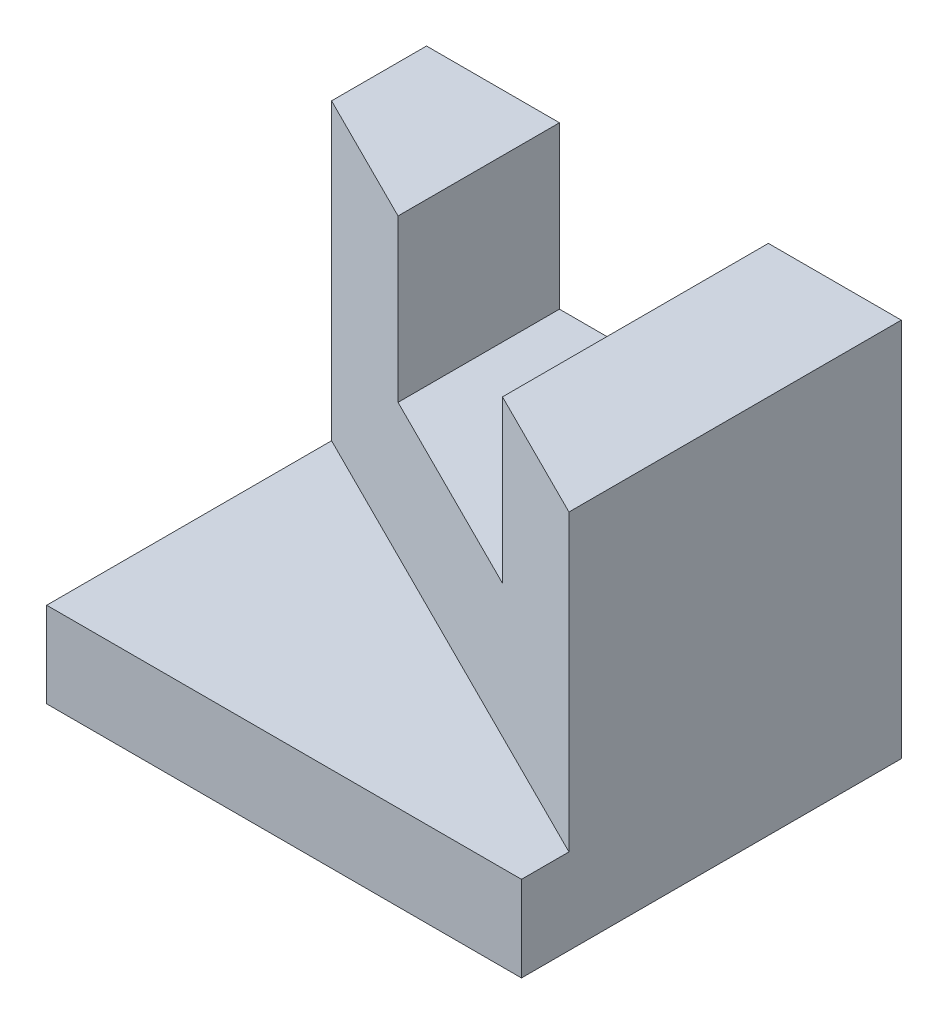
ISO-10303-21;
HEADER;
FILE_DESCRIPTION(('STEP AP214'),'2;1');
FILE_NAME('part.step','',(''),(''),'','','');
FILE_SCHEMA(('AUTOMOTIVE_DESIGN { 1 0 10303 214 1 1 1 1 }'));
ENDSEC;
DATA;
#1=APPLICATION_CONTEXT('core data for automotive mechanical design processes');
#2=APPLICATION_PROTOCOL_DEFINITION('international standard','automotive_design',2000,#1);
#3=PRODUCT_CONTEXT('',#1,'mechanical');
#4=PRODUCT('Part','Part','',(#3));
#5=PRODUCT_RELATED_PRODUCT_CATEGORY('part','',(#4));
#6=PRODUCT_DEFINITION_FORMATION('','',#4);
#7=PRODUCT_DEFINITION_CONTEXT('part definition',#1,'design');
#8=PRODUCT_DEFINITION('design','',#6,#7);
#9=PRODUCT_DEFINITION_SHAPE('','',#8);
#10=(LENGTH_UNIT() NAMED_UNIT(*) SI_UNIT(.MILLI.,.METRE.));
#11=(NAMED_UNIT(*) PLANE_ANGLE_UNIT() SI_UNIT($,.RADIAN.));
#12=(NAMED_UNIT(*) SI_UNIT($,.STERADIAN.) SOLID_ANGLE_UNIT());
#13=UNCERTAINTY_MEASURE_WITH_UNIT(LENGTH_MEASURE(1.E-05),#10,'distance_accuracy_value','');
#14=(GEOMETRIC_REPRESENTATION_CONTEXT(3) GLOBAL_UNCERTAINTY_ASSIGNED_CONTEXT((#13)) GLOBAL_UNIT_ASSIGNED_CONTEXT((#10,
#11,#12)) REPRESENTATION_CONTEXT('',''));
#15=CARTESIAN_POINT('',(0.,0.,0.));
#16=DIRECTION('',(0.,0.,1.));
#17=DIRECTION('',(1.,0.,0.));
#18=AXIS2_PLACEMENT_3D('',#15,#16,#17);
#19=CARTESIAN_POINT('',(0.,80.,0.));
#20=DIRECTION('',(0.,-1.,0.));
#21=DIRECTION('',(0.,0.,-1.));
#22=AXIS2_PLACEMENT_3D('',#19,#20,#21);
#23=PLANE('',#22);
#24=DIRECTION('',(-0.894427190999916,0.,-0.447213595499958));
#25=VECTOR('',#24,1.);
#26=CARTESIAN_POINT('',(100.,80.,70.));
#27=LINE('',#26,#25);
#28=CARTESIAN_POINT('',(28.,80.,34.));
#29=VERTEX_POINT('',#28);
#30=CARTESIAN_POINT('',(0.,80.,20.));
#31=VERTEX_POINT('',#30);
#32=EDGE_CURVE('E239',#29,#31,#27,.T.);
#33=ORIENTED_EDGE('',*,*,#32,.F.);
#34=DIRECTION('',(0.,0.,-1.));
#35=VECTOR('',#34,1.);
#36=CARTESIAN_POINT('',(28.,80.,0.));
#37=LINE('',#36,#35);
#38=CARTESIAN_POINT('',(28.,80.,0.));
#39=VERTEX_POINT('',#38);
#40=EDGE_CURVE('E163',#29,#39,#37,.T.);
#41=ORIENTED_EDGE('',*,*,#40,.T.);
#42=DIRECTION('',(1.,0.,0.));
#43=VECTOR('',#42,1.);
#44=CARTESIAN_POINT('',(0.,80.,0.));
#45=LINE('',#44,#43);
#46=CARTESIAN_POINT('',(0.,80.,0.));
#47=VERTEX_POINT('',#46);
#48=EDGE_CURVE('E271',#47,#39,#45,.T.);
#49=ORIENTED_EDGE('',*,*,#48,.F.);
#50=DIRECTION('',(0.,0.,-1.));
#51=VECTOR('',#50,1.);
#52=CARTESIAN_POINT('',(0.,80.,20.));
#53=LINE('',#52,#51);
#54=EDGE_CURVE('E294',#31,#47,#53,.T.);
#55=ORIENTED_EDGE('',*,*,#54,.F.);
#56=EDGE_LOOP('',(#33,#41,#49,#55));
#57=FACE_BOUND('',#56,.T.);
#58=ADVANCED_FACE('F69',(#57),#23,.F.);
#59=CARTESIAN_POINT('',(0.,18.,0.));
#60=DIRECTION('',(0.,-1.,0.));
#61=DIRECTION('',(0.,0.,-1.));
#62=AXIS2_PLACEMENT_3D('',#59,#60,#61);
#63=PLANE('',#62);
#64=DIRECTION('',(0.,0.,1.));
#65=VECTOR('',#64,1.);
#66=CARTESIAN_POINT('',(100.,18.,0.));
#67=LINE('',#66,#65);
#68=CARTESIAN_POINT('',(100.,18.,70.));
#69=VERTEX_POINT('',#68);
#70=CARTESIAN_POINT('',(100.,18.,80.));
#71=VERTEX_POINT('',#70);
#72=EDGE_CURVE('E493',#69,#71,#67,.T.);
#73=ORIENTED_EDGE('',*,*,#72,.F.);
#74=DIRECTION('',(-0.894427190999916,0.,-0.447213595499958));
#75=VECTOR('',#74,1.);
#76=CARTESIAN_POINT('',(100.,18.,70.));
#77=LINE('',#76,#75);
#78=CARTESIAN_POINT('',(0.,18.,20.));
#79=VERTEX_POINT('',#78);
#80=EDGE_CURVE('E180',#69,#79,#77,.T.);
#81=ORIENTED_EDGE('',*,*,#80,.T.);
#82=DIRECTION('',(0.,0.,-1.));
#83=VECTOR('',#82,1.);
#84=CARTESIAN_POINT('',(0.,18.,80.));
#85=LINE('',#84,#83);
#86=CARTESIAN_POINT('',(0.,18.,80.));
#87=VERTEX_POINT('',#86);
#88=EDGE_CURVE('E568',#87,#79,#85,.T.);
#89=ORIENTED_EDGE('',*,*,#88,.F.);
#90=DIRECTION('',(-1.,0.,0.));
#91=VECTOR('',#90,1.);
#92=CARTESIAN_POINT('',(100.,18.,80.));
#93=LINE('',#92,#91);
#94=EDGE_CURVE('E548',#71,#87,#93,.T.);
#95=ORIENTED_EDGE('',*,*,#94,.F.);
#96=EDGE_LOOP('',(#73,#81,#89,#95));
#97=FACE_BOUND('',#96,.T.);
#98=ADVANCED_FACE('F71',(#97),#63,.F.);
#99=CARTESIAN_POINT('',(0.,0.,0.));
#100=DIRECTION('',(0.,-1.,0.));
#101=DIRECTION('',(0.,0.,-1.));
#102=AXIS2_PLACEMENT_3D('',#99,#100,#101);
#103=PLANE('',#102);
#104=DIRECTION('',(0.,0.,-1.));
#105=VECTOR('',#104,1.);
#106=CARTESIAN_POINT('',(0.,0.,80.));
#107=LINE('',#106,#105);
#108=CARTESIAN_POINT('',(0.,0.,80.));
#109=VERTEX_POINT('',#108);
#110=CARTESIAN_POINT('',(0.,0.,0.));
#111=VERTEX_POINT('',#110);
#112=EDGE_CURVE('E293',#109,#111,#107,.T.);
#113=ORIENTED_EDGE('',*,*,#112,.T.);
#114=DIRECTION('',(1.,0.,0.));
#115=VECTOR('',#114,1.);
#116=CARTESIAN_POINT('',(0.,0.,0.));
#117=LINE('',#116,#115);
#118=CARTESIAN_POINT('',(100.,0.,0.));
#119=VERTEX_POINT('',#118);
#120=EDGE_CURVE('E454',#111,#119,#117,.T.);
#121=ORIENTED_EDGE('',*,*,#120,.T.);
#122=DIRECTION('',(0.,0.,1.));
#123=VECTOR('',#122,1.);
#124=CARTESIAN_POINT('',(100.,0.,0.));
#125=LINE('',#124,#123);
#126=CARTESIAN_POINT('',(100.,0.,80.));
#127=VERTEX_POINT('',#126);
#128=EDGE_CURVE('E491',#119,#127,#125,.T.);
#129=ORIENTED_EDGE('',*,*,#128,.T.);
#130=DIRECTION('',(-1.,0.,0.));
#131=VECTOR('',#130,1.);
#132=CARTESIAN_POINT('',(100.,0.,80.));
#133=LINE('',#132,#131);
#134=EDGE_CURVE('E497',#127,#109,#133,.T.);
#135=ORIENTED_EDGE('',*,*,#134,.T.);
#136=EDGE_LOOP('',(#113,#121,#129,#135));
#137=FACE_BOUND('',#136,.T.);
#138=ADVANCED_FACE('F329',(#137),#103,.T.);
#139=CARTESIAN_POINT('',(0.,0.,0.));
#140=DIRECTION('',(-1.,0.,0.));
#141=DIRECTION('',(0.,0.,1.));
#142=AXIS2_PLACEMENT_3D('',#139,#140,#141);
#143=PLANE('',#142);
#144=CARTESIAN_POINT('',(0.,0.,80.));
#145=DIRECTION('',(0.,1.,0.));
#146=VECTOR('',#145,1.);
#147=LINE('',#144,#146);
#148=EDGE_CURVE('E456',#109,#87,#147,.T.);
#149=ORIENTED_EDGE('',*,*,#148,.T.);
#150=ORIENTED_EDGE('',*,*,#88,.T.);
#151=CARTESIAN_POINT('',(0.,18.,20.));
#152=DIRECTION('',(0.,1.,0.));
#153=VECTOR('',#152,1.);
#154=LINE('',#151,#153);
#155=EDGE_CURVE('E97',#79,#31,#154,.T.);
#156=ORIENTED_EDGE('',*,*,#155,.T.);
#157=ORIENTED_EDGE('',*,*,#54,.T.);
#158=CARTESIAN_POINT('',(0.,18.,0.));
#159=DIRECTION('',(0.,1.,0.));
#160=VECTOR('',#159,1.);
#161=LINE('',#158,#160);
#162=CARTESIAN_POINT('',(0.,18.,0.));
#163=VERTEX_POINT('',#162);
#164=EDGE_CURVE('E445',#163,#47,#161,.T.);
#165=ORIENTED_EDGE('',*,*,#164,.F.);
#166=CARTESIAN_POINT('',(0.,0.,0.));
#167=DIRECTION('',(0.,1.,0.));
#168=VECTOR('',#167,1.);
#169=LINE('',#166,#168);
#170=EDGE_CURVE('E448',#111,#163,#169,.T.);
#171=ORIENTED_EDGE('',*,*,#170,.F.);
#172=ORIENTED_EDGE('',*,*,#112,.F.);
#173=EDGE_LOOP('',(#149,#150,#156,#157,#165,#171,#172));
#174=FACE_BOUND('',#173,.T.);
#175=ADVANCED_FACE('F403',(#174),#143,.T.);
#176=CARTESIAN_POINT('',(0.,0.,0.));
#177=DIRECTION('',(0.,0.,-1.));
#178=DIRECTION('',(-1.,0.,0.));
#179=AXIS2_PLACEMENT_3D('',#176,#177,#178);
#180=PLANE('',#179);
#181=DIRECTION('',(0.,1.,0.));
#182=VECTOR('',#181,1.);
#183=CARTESIAN_POINT('',(28.,0.,0.));
#184=LINE('',#183,#182);
#185=CARTESIAN_POINT('',(28.,46.,0.));
#186=VERTEX_POINT('',#185);
#187=EDGE_CURVE('E179',#186,#39,#184,.T.);
#188=ORIENTED_EDGE('',*,*,#187,.F.);
#189=DIRECTION('',(-1.,0.,0.));
#190=VECTOR('',#189,1.);
#191=CARTESIAN_POINT('',(0.,46.,0.));
#192=LINE('',#191,#190);
#193=CARTESIAN_POINT('',(72.,46.,0.));
#194=VERTEX_POINT('',#193);
#195=EDGE_CURVE('E169',#194,#186,#192,.T.);
#196=ORIENTED_EDGE('',*,*,#195,.F.);
#197=DIRECTION('',(0.,-1.,0.));
#198=VECTOR('',#197,1.);
#199=CARTESIAN_POINT('',(72.,0.,0.));
#200=LINE('',#199,#198);
#201=CARTESIAN_POINT('',(72.,80.,0.));
#202=VERTEX_POINT('',#201);
#203=EDGE_CURVE('E156',#202,#194,#200,.T.);
#204=ORIENTED_EDGE('',*,*,#203,.F.);
#205=CARTESIAN_POINT('',(100.,80.,0.));
#206=VERTEX_POINT('',#205);
#207=EDGE_CURVE('E289',#202,#206,#45,.T.);
#208=ORIENTED_EDGE('',*,*,#207,.T.);
#209=CARTESIAN_POINT('',(100.,18.,0.));
#210=DIRECTION('',(0.,1.,0.));
#211=VECTOR('',#210,1.);
#212=LINE('',#209,#211);
#213=CARTESIAN_POINT('',(100.,18.,0.));
#214=VERTEX_POINT('',#213);
#215=EDGE_CURVE('E589',#214,#206,#212,.T.);
#216=ORIENTED_EDGE('',*,*,#215,.F.);
#217=CARTESIAN_POINT('',(100.,0.,0.));
#218=DIRECTION('',(0.,1.,0.));
#219=VECTOR('',#218,1.);
#220=LINE('',#217,#219);
#221=EDGE_CURVE('E496',#119,#214,#220,.T.);
#222=ORIENTED_EDGE('',*,*,#221,.F.);
#223=ORIENTED_EDGE('',*,*,#120,.F.);
#224=ORIENTED_EDGE('',*,*,#170,.T.);
#225=ORIENTED_EDGE('',*,*,#164,.T.);
#226=ORIENTED_EDGE('',*,*,#48,.T.);
#227=EDGE_LOOP('',(#188,#196,#204,#208,#216,#222,#223,#224,#225,#226));
#228=FACE_BOUND('',#227,.T.);
#229=ADVANCED_FACE('F177',(#228),#180,.T.);
#230=CARTESIAN_POINT('',(0.,0.,80.));
#231=DIRECTION('',(0.,0.,1.));
#232=DIRECTION('',(1.,0.,0.));
#233=AXIS2_PLACEMENT_3D('',#230,#231,#232);
#234=PLANE('',#233);
#235=CARTESIAN_POINT('',(100.,0.,80.));
#236=DIRECTION('',(0.,1.,0.));
#237=VECTOR('',#236,1.);
#238=LINE('',#235,#237);
#239=EDGE_CURVE('E455',#127,#71,#238,.T.);
#240=ORIENTED_EDGE('',*,*,#239,.T.);
#241=ORIENTED_EDGE('',*,*,#94,.T.);
#242=ORIENTED_EDGE('',*,*,#148,.F.);
#243=ORIENTED_EDGE('',*,*,#134,.F.);
#244=EDGE_LOOP('',(#240,#241,#242,#243));
#245=FACE_BOUND('',#244,.T.);
#246=ADVANCED_FACE('F335',(#245),#234,.T.);
#247=CARTESIAN_POINT('',(100.,0.,0.));
#248=DIRECTION('',(1.,0.,0.));
#249=DIRECTION('',(0.,0.,-1.));
#250=AXIS2_PLACEMENT_3D('',#247,#248,#249);
#251=PLANE('',#250);
#252=ORIENTED_EDGE('',*,*,#221,.T.);
#253=ORIENTED_EDGE('',*,*,#215,.T.);
#254=DIRECTION('',(0.,0.,1.));
#255=VECTOR('',#254,1.);
#256=CARTESIAN_POINT('',(100.,80.,0.));
#257=LINE('',#256,#255);
#258=CARTESIAN_POINT('',(100.,80.,70.));
#259=VERTEX_POINT('',#258);
#260=EDGE_CURVE('E267',#206,#259,#257,.T.);
#261=ORIENTED_EDGE('',*,*,#260,.T.);
#262=CARTESIAN_POINT('',(100.,18.,70.));
#263=DIRECTION('',(0.,1.,0.));
#264=VECTOR('',#263,1.);
#265=LINE('',#262,#264);
#266=EDGE_CURVE('E387',#69,#259,#265,.T.);
#267=ORIENTED_EDGE('',*,*,#266,.F.);
#268=ORIENTED_EDGE('',*,*,#72,.T.);
#269=ORIENTED_EDGE('',*,*,#239,.F.);
#270=ORIENTED_EDGE('',*,*,#128,.F.);
#271=EDGE_LOOP('',(#252,#253,#261,#267,#268,#269,#270));
#272=FACE_BOUND('',#271,.T.);
#273=ADVANCED_FACE('F332',(#272),#251,.T.);
#274=ORIENTED_EDGE('',*,*,#207,.F.);
#275=DIRECTION('',(0.,0.,1.));
#276=VECTOR('',#275,1.);
#277=CARTESIAN_POINT('',(72.,80.,0.));
#278=LINE('',#277,#276);
#279=CARTESIAN_POINT('',(72.,80.,56.));
#280=VERTEX_POINT('',#279);
#281=EDGE_CURVE('E159',#202,#280,#278,.T.);
#282=ORIENTED_EDGE('',*,*,#281,.T.);
#283=EDGE_CURVE('E222',#259,#280,#27,.T.);
#284=ORIENTED_EDGE('',*,*,#283,.F.);
#285=ORIENTED_EDGE('',*,*,#260,.F.);
#286=EDGE_LOOP('',(#274,#282,#284,#285));
#287=FACE_BOUND('',#286,.T.);
#288=ADVANCED_FACE('F205',(#287),#23,.F.);
#289=CARTESIAN_POINT('',(-8.00000000000001,0.,16.));
#290=DIRECTION('',(-0.447213595499958,0.,0.894427190999916));
#291=DIRECTION('',(0.894427190999916,0.,0.447213595499958));
#292=AXIS2_PLACEMENT_3D('',#289,#290,#291);
#293=PLANE('',#292);
#294=DIRECTION('',(0.,-1.,0.));
#295=VECTOR('',#294,1.);
#296=CARTESIAN_POINT('',(28.,0.,34.));
#297=LINE('',#296,#295);
#298=CARTESIAN_POINT('',(28.,46.,34.));
#299=VERTEX_POINT('',#298);
#300=EDGE_CURVE('E12',#29,#299,#297,.T.);
#301=ORIENTED_EDGE('',*,*,#300,.F.);
#302=ORIENTED_EDGE('',*,*,#32,.T.);
#303=ORIENTED_EDGE('',*,*,#155,.F.);
#304=ORIENTED_EDGE('',*,*,#80,.F.);
#305=ORIENTED_EDGE('',*,*,#266,.T.);
#306=ORIENTED_EDGE('',*,*,#283,.T.);
#307=DIRECTION('',(0.,1.,0.));
#308=VECTOR('',#307,1.);
#309=CARTESIAN_POINT('',(72.,0.,56.));
#310=LINE('',#309,#308);
#311=CARTESIAN_POINT('',(72.,46.,56.));
#312=VERTEX_POINT('',#311);
#313=EDGE_CURVE('E249',#312,#280,#310,.T.);
#314=ORIENTED_EDGE('',*,*,#313,.F.);
#315=DIRECTION('',(0.894427190999916,0.,0.447213595499958));
#316=VECTOR('',#315,1.);
#317=CARTESIAN_POINT('',(-8.00000000000001,46.,16.));
#318=LINE('',#317,#316);
#319=EDGE_CURVE('E80',#299,#312,#318,.T.);
#320=ORIENTED_EDGE('',*,*,#319,.F.);
#321=EDGE_LOOP('',(#301,#302,#303,#304,#305,#306,#314,#320));
#322=FACE_BOUND('',#321,.T.);
#323=ADVANCED_FACE('F195',(#322),#293,.T.);
#324=CARTESIAN_POINT('',(0.,46.,0.));
#325=DIRECTION('',(0.,-1.,0.));
#326=DIRECTION('',(0.,0.,-1.));
#327=AXIS2_PLACEMENT_3D('',#324,#325,#326);
#328=PLANE('',#327);
#329=ORIENTED_EDGE('',*,*,#195,.T.);
#330=DIRECTION('',(0.,0.,-1.));
#331=VECTOR('',#330,1.);
#332=CARTESIAN_POINT('',(28.,46.,90.));
#333=LINE('',#332,#331);
#334=EDGE_CURVE('E74',#299,#186,#333,.T.);
#335=ORIENTED_EDGE('',*,*,#334,.F.);
#336=ORIENTED_EDGE('',*,*,#319,.T.);
#337=DIRECTION('',(0.,0.,1.));
#338=VECTOR('',#337,1.);
#339=CARTESIAN_POINT('',(72.,46.,-10.));
#340=LINE('',#339,#338);
#341=EDGE_CURVE('E88',#194,#312,#340,.T.);
#342=ORIENTED_EDGE('',*,*,#341,.F.);
#343=EDGE_LOOP('',(#329,#335,#336,#342));
#344=FACE_BOUND('',#343,.T.);
#345=ADVANCED_FACE('F167',(#344),#328,.F.);
#346=CARTESIAN_POINT('',(28.,0.,0.));
#347=DIRECTION('',(-1.,0.,0.));
#348=DIRECTION('',(0.,0.,1.));
#349=AXIS2_PLACEMENT_3D('',#346,#347,#348);
#350=PLANE('',#349);
#351=ORIENTED_EDGE('',*,*,#187,.T.);
#352=ORIENTED_EDGE('',*,*,#40,.F.);
#353=ORIENTED_EDGE('',*,*,#300,.T.);
#354=ORIENTED_EDGE('',*,*,#334,.T.);
#355=EDGE_LOOP('',(#351,#352,#353,#354));
#356=FACE_BOUND('',#355,.T.);
#357=ADVANCED_FACE('F315',(#356),#350,.F.);
#358=CARTESIAN_POINT('',(72.,0.,0.));
#359=DIRECTION('',(1.,0.,0.));
#360=DIRECTION('',(0.,0.,-1.));
#361=AXIS2_PLACEMENT_3D('',#358,#359,#360);
#362=PLANE('',#361);
#363=ORIENTED_EDGE('',*,*,#203,.T.);
#364=ORIENTED_EDGE('',*,*,#341,.T.);
#365=ORIENTED_EDGE('',*,*,#313,.T.);
#366=ORIENTED_EDGE('',*,*,#281,.F.);
#367=EDGE_LOOP('',(#363,#364,#365,#366));
#368=FACE_BOUND('',#367,.T.);
#369=ADVANCED_FACE('F157',(#368),#362,.F.);
#370=CLOSED_SHELL('',(#58,#98,#138,#175,#229,#246,#273,#288,#323,#345,#357,#369));
#371=MANIFOLD_SOLID_BREP('B2',#370);
#372=ADVANCED_BREP_SHAPE_REPRESENTATION('',(#18,#371),#14);
#373=SHAPE_DEFINITION_REPRESENTATION(#9,#372);
ENDSEC;
END-ISO-10303-21;
